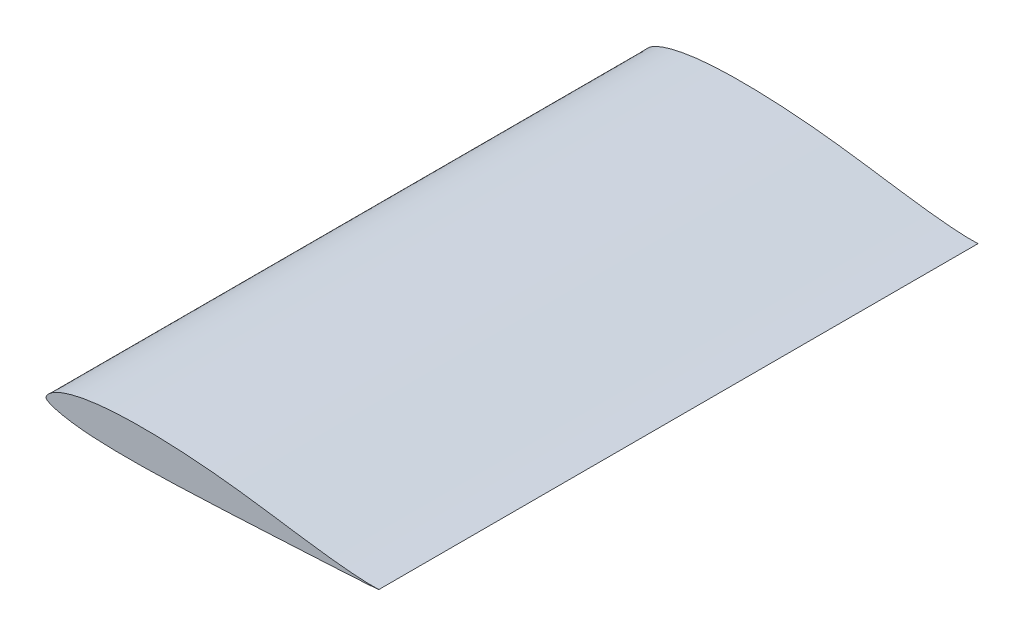
ISO-10303-21;
HEADER;
FILE_DESCRIPTION(('STEP AP214'),'2;1');
FILE_NAME('part.step','',(''),(''),'','','');
FILE_SCHEMA(('AUTOMOTIVE_DESIGN { 1 0 10303 214 1 1 1 1 }'));
ENDSEC;
DATA;
#1=APPLICATION_CONTEXT('core data for automotive mechanical design processes');
#2=APPLICATION_PROTOCOL_DEFINITION('international standard','automotive_design',2000,#1);
#3=PRODUCT_CONTEXT('',#1,'mechanical');
#4=PRODUCT('Part','Part','',(#3));
#5=PRODUCT_RELATED_PRODUCT_CATEGORY('part','',(#4));
#6=PRODUCT_DEFINITION_FORMATION('','',#4);
#7=PRODUCT_DEFINITION_CONTEXT('part definition',#1,'design');
#8=PRODUCT_DEFINITION('design','',#6,#7);
#9=PRODUCT_DEFINITION_SHAPE('','',#8);
#10=(LENGTH_UNIT() NAMED_UNIT(*) SI_UNIT(.MILLI.,.METRE.));
#11=(NAMED_UNIT(*) PLANE_ANGLE_UNIT() SI_UNIT($,.RADIAN.));
#12=(NAMED_UNIT(*) SI_UNIT($,.STERADIAN.) SOLID_ANGLE_UNIT());
#13=UNCERTAINTY_MEASURE_WITH_UNIT(LENGTH_MEASURE(1.E-05),#10,'distance_accuracy_value','');
#14=(GEOMETRIC_REPRESENTATION_CONTEXT(3) GLOBAL_UNCERTAINTY_ASSIGNED_CONTEXT((#13)) GLOBAL_UNIT_ASSIGNED_CONTEXT((#10,
#11,#12)) REPRESENTATION_CONTEXT('',''));
#15=CARTESIAN_POINT('',(0.,0.,0.));
#16=DIRECTION('',(0.,0.,1.));
#17=DIRECTION('',(1.,0.,0.));
#18=AXIS2_PLACEMENT_3D('',#15,#16,#17);
#19=CARTESIAN_POINT('',(100.,0.,180.));
#20=CARTESIAN_POINT('',(99.8731297421562,-0.0071263496234226,180.));
#21=CARTESIAN_POINT('',(99.5858986589307,-0.0220126325913472,180.));
#22=CARTESIAN_POINT('',(99.0723048944118,-0.0416908256166476,180.));
#23=CARTESIAN_POINT('',(98.3949638322904,-0.054005184052448,180.));
#24=CARTESIAN_POINT('',(97.5264118950756,-0.048417602615349,180.));
#25=CARTESIAN_POINT('',(96.4742931152867,-0.0203468103291035,180.));
#26=CARTESIAN_POINT('',(95.2465886939689,0.0314161833677873,180.));
#27=CARTESIAN_POINT('',(93.8505545777795,0.109574322760666,180.));
#28=CARTESIAN_POINT('',(92.293438030096,0.216481199586872,180.));
#29=CARTESIAN_POINT('',(90.5839619748836,0.355281050278794,180.));
#30=CARTESIAN_POINT('',(88.7334184387809,0.530991147040493,180.));
#31=CARTESIAN_POINT('',(86.7544527316392,0.743867583433741,180.));
#32=CARTESIAN_POINT('',(84.6592789398354,0.989937128321574,180.));
#33=CARTESIAN_POINT('',(82.459263130372,1.2664136743809,180.));
#34=CARTESIAN_POINT('',(80.1654376573725,1.57077847972011,180.));
#35=CARTESIAN_POINT('',(77.7889565729793,1.89945298186307,180.));
#36=CARTESIAN_POINT('',(75.3412148178229,2.24895922044247,180.));
#37=CARTESIAN_POINT('',(72.8328844359919,2.61390842251398,180.));
#38=CARTESIAN_POINT('',(70.2739152158194,2.9879952945212,180.));
#39=CARTESIAN_POINT('',(67.6745665606944,3.36710228924046,180.));
#40=CARTESIAN_POINT('',(65.0452696641362,3.74695580910662,180.));
#41=CARTESIAN_POINT('',(62.3930712753113,4.11701011707328,180.));
#42=CARTESIAN_POINT('',(59.7222322435053,4.46614480992606,180.));
#43=CARTESIAN_POINT('',(57.0391124993759,4.79810085083192,180.));
#44=CARTESIAN_POINT('',(54.351072114392,5.11213643643074,180.));
#45=CARTESIAN_POINT('',(51.6638315199252,5.39859094513008,180.));
#46=CARTESIAN_POINT('',(48.9815616144335,5.65263715778855,180.));
#47=CARTESIAN_POINT('',(46.3100785738808,5.87963794657507,180.));
#48=CARTESIAN_POINT('',(43.6565667998708,6.08014478723578,180.));
#49=CARTESIAN_POINT('',(41.028212232193,6.24947189211477,180.));
#50=CARTESIAN_POINT('',(38.4317076056366,6.38719861133135,180.));
#51=CARTESIAN_POINT('',(35.8744098434276,6.4956530697219,180.));
#52=CARTESIAN_POINT('',(33.3638716032272,6.57370683492832,180.));
#53=CARTESIAN_POINT('',(30.9070042879261,6.61795698852851,180.));
#54=CARTESIAN_POINT('',(28.5103565026845,6.62885009018535,180.));
#55=CARTESIAN_POINT('',(26.1810233749512,6.60840813007817,180.));
#56=CARTESIAN_POINT('',(23.9252329197264,6.55384718160539,180.));
#57=CARTESIAN_POINT('',(21.7477203312338,6.45971710785833,180.));
#58=CARTESIAN_POINT('',(19.6525516460904,6.33044077426623,180.));
#59=CARTESIAN_POINT('',(17.6447594134454,6.16963284704309,180.));
#60=CARTESIAN_POINT('',(15.7295966293119,5.97477202195844,180.));
#61=CARTESIAN_POINT('',(13.9109222435092,5.74331610646346,180.));
#62=CARTESIAN_POINT('',(12.1916017024725,5.48103748004068,180.));
#63=CARTESIAN_POINT('',(10.5754215524693,5.19159137924493,180.));
#64=CARTESIAN_POINT('',(9.06674853439058,4.87341840970931,180.));
#65=CARTESIAN_POINT('',(7.66854270262216,4.52701692788772,180.));
#66=CARTESIAN_POINT('',(6.38269909930736,4.15872088103797,180.));
#67=CARTESIAN_POINT('',(5.21166840884851,3.77135793205396,180.));
#68=CARTESIAN_POINT('',(4.15843908077848,3.36166084747128,180.));
#69=CARTESIAN_POINT('',(3.22292496827148,2.93310357259603,180.));
#70=CARTESIAN_POINT('',(2.40312425373494,2.49580371156189,180.));
#71=CARTESIAN_POINT('',(1.70014651075729,2.0549190730769,180.));
#72=CARTESIAN_POINT('',(1.11712391919751,1.6113443885371,180.));
#73=CARTESIAN_POINT('',(0.654431197921683,1.17440664764067,180.));
#74=CARTESIAN_POINT('',(0.305369199779341,0.755795207474001,180.));
#75=CARTESIAN_POINT('',(0.0876320705638158,0.371336729496624,180.));
#76=CARTESIAN_POINT('',(-0.0375359166936739,0.0106234864450049,180.));
#77=CARTESIAN_POINT('',(0.0834277973505954,-0.347444654246188,180.));
#78=CARTESIAN_POINT('',(0.421891675032964,-0.608211671687224,180.));
#79=CARTESIAN_POINT('',(0.874203128487307,-0.88822946935296,180.));
#80=CARTESIAN_POINT('',(1.4854499230709,-1.16534033419914,180.));
#81=CARTESIAN_POINT('',(2.23675136841454,-1.44188835342177,180.));
#82=CARTESIAN_POINT('',(3.13070633333904,-1.70878886604571,180.));
#83=CARTESIAN_POINT('',(4.16162986649332,-1.96682766117413,180.));
#84=CARTESIAN_POINT('',(5.32673683522163,-2.21279833046687,180.));
#85=CARTESIAN_POINT('',(6.62252423174852,-2.44292365151748,180.));
#86=CARTESIAN_POINT('',(8.04563021430656,-2.65465651996099,180.));
#87=CARTESIAN_POINT('',(9.59169102075808,-2.84803900103557,180.));
#88=CARTESIAN_POINT('',(11.2569522978932,-3.01996713020043,180.));
#89=CARTESIAN_POINT('',(13.038706849025,-3.16518052334094,180.));
#90=CARTESIAN_POINT('',(14.9338874169425,-3.2844037475508,180.));
#91=CARTESIAN_POINT('',(16.9379452884749,-3.38113026319625,180.));
#92=CARTESIAN_POINT('',(19.0459512735452,-3.45358896561638,180.));
#93=CARTESIAN_POINT('',(21.2535416262673,-3.49817384575008,180.));
#94=CARTESIAN_POINT('',(23.556044840974,-3.51884927836008,180.));
#95=CARTESIAN_POINT('',(25.9473188618634,-3.51947842136448,180.));
#96=CARTESIAN_POINT('',(28.4201356899826,-3.4997878983331,180.));
#97=CARTESIAN_POINT('',(30.9674344702377,-3.45954230976529,180.));
#98=CARTESIAN_POINT('',(33.5819134325002,-3.40194195053157,180.));
#99=CARTESIAN_POINT('',(36.2554854689595,-3.32943994368192,180.));
#100=CARTESIAN_POINT('',(38.9796993341622,-3.24195254091815,180.));
#101=CARTESIAN_POINT('',(41.7463859928491,-3.14046751319212,180.));
#102=CARTESIAN_POINT('',(44.5471274409492,-3.02795034394874,180.));
#103=CARTESIAN_POINT('',(47.3728093632821,-2.90675691317364,180.));
#104=CARTESIAN_POINT('',(50.2138352085322,-2.77800260829067,180.));
#105=CARTESIAN_POINT('',(53.0606447754066,-2.64344446057426,180.));
#106=CARTESIAN_POINT('',(55.9035928277926,-2.50459674549005,180.));
#107=CARTESIAN_POINT('',(58.7328615073874,-2.3631437087377,180.));
#108=CARTESIAN_POINT('',(61.5384851172286,-2.22050037318021,180.));
#109=CARTESIAN_POINT('',(65.2035936921467,-2.03181279265427,180.));
#110=CARTESIAN_POINT('',(67.9322719264146,-1.88880548265009,180.));
#111=CARTESIAN_POINT('',(69.735876,-1.793852,180.));
#112=B_SPLINE_CURVE_WITH_KNOTS('',3,(#19,#20,#21,#22,#23,#24,#25,#26,#27,#28,#29,#30,#31,#32,
#33,#34,#35,#36,#37,#38,#39,#40,#41,#42,#43,#44,#45,#46,#47,#48,#49,#50,#51,#52,#53,#54,#55,#56,
#57,#58,#59,#60,#61,#62,#63,#64,#65,#66,#67,#68,#69,#70,#71,#72,#73,#74,#75,#76,#77,#78,#79,#80,
#81,#82,#83,#84,#85,#86,#87,#88,#89,#90,#91,#92,#93,#94,#95,#96,#97,#98,#99,#100,#101,#102,#103,
#104,#105,#106,#107,#108,#109,#110,#111),.UNSPECIFIED.,.F.,.F.,(4,1,1,1,1,1,1,1,1,1,1,1,1,1,1,1,
1,1,1,1,1,1,1,1,1,1,1,1,1,1,1,1,1,1,1,1,1,1,1,1,1,1,1,1,1,1,1,1,1,1,1,1,1,1,1,1,1,1,1,1,1,1,1,1,
1,1,1,1,1,1,1,1,1,1,1,1,1,1,1,1,1,1,1,1,1,1,1,1,1,1,4),(0.,0.00220923852363808,
0.00500040715276348,0.00893547922845685,0.0139862944004528,0.0200999110607274,
0.0272331623928546,0.035349325377806,0.0444085815951702,0.0543681525349889,0.0651671223766626,
0.0767257423775045,0.0889721123671874,0.101843595876724,0.115275578830099,0.129201713347357,
0.143554069568907,0.158263416591045,0.173270548744768,0.188517036593157,0.203933656803972,
0.219457904412566,0.235074265065449,0.250763230849998,0.266461846300673,0.282125694194801,
0.297747091203574,0.313303395461786,0.328738699173902,0.344011606020782,0.359093531866023,
0.373943938781869,0.388511763473504,0.402761603282726,0.416664517324197,0.430178949571932,
0.443259533116455,0.455893010987885,0.46807008508328,0.479753340697727,0.490909964397989,
0.501535740841807,0.511624326593847,0.52114471215526,0.530077940880876,0.538426036081611,
0.546183426212128,0.553327174825242,0.559863049803919,0.565821039718911,0.571206957611546,
0.576005951092428,0.580233937768203,0.583918525257428,0.587059664699692,0.589647220098959,
0.591628453572832,0.593459553301607,0.595772041571616,0.598875730372835,0.602752548480143,
0.607392102872526,0.612796440306052,0.61896066587947,0.625865320980244,0.633494769221233,
0.641838350428337,0.650876949497999,0.660581819535131,0.670942079794454,0.68195496405002,
0.693595004344251,0.705823985623181,0.718625021858571,0.731982781166551,0.745856178462826,
0.760199101492908,0.774975912832791,0.790148519065502,0.805665087144037,0.821475377246348,
0.837535770780905,0.853798758259788,0.870208111852747,0.886708024088562,0.903243326604065,
0.919757809558127,0.936194252122913,0.952494258927816,0.968599217269703,1.),.UNSPECIFIED.);
#113=DIRECTION('',(0.,0.,-1.));
#114=VECTOR('',#113,1.);
#115=SURFACE_OF_LINEAR_EXTRUSION('',#112,#114);
#116=CARTESIAN_POINT('',(100.,0.,0.));
#117=CARTESIAN_POINT('',(99.8731297421562,-0.0071263496234226,0.));
#118=CARTESIAN_POINT('',(99.5858986589307,-0.0220126325913472,0.));
#119=CARTESIAN_POINT('',(99.0723048944118,-0.0416908256166476,0.));
#120=CARTESIAN_POINT('',(98.3949638322904,-0.054005184052448,0.));
#121=CARTESIAN_POINT('',(97.5264118950756,-0.048417602615349,0.));
#122=CARTESIAN_POINT('',(96.4742931152867,-0.0203468103291035,0.));
#123=CARTESIAN_POINT('',(95.2465886939689,0.0314161833677873,0.));
#124=CARTESIAN_POINT('',(93.8505545777795,0.109574322760666,0.));
#125=CARTESIAN_POINT('',(92.293438030096,0.216481199586872,0.));
#126=CARTESIAN_POINT('',(90.5839619748836,0.355281050278794,0.));
#127=CARTESIAN_POINT('',(88.7334184387809,0.530991147040493,0.));
#128=CARTESIAN_POINT('',(86.7544527316392,0.743867583433741,0.));
#129=CARTESIAN_POINT('',(84.6592789398354,0.989937128321574,0.));
#130=CARTESIAN_POINT('',(82.459263130372,1.2664136743809,0.));
#131=CARTESIAN_POINT('',(80.1654376573725,1.57077847972011,0.));
#132=CARTESIAN_POINT('',(77.7889565729793,1.89945298186307,0.));
#133=CARTESIAN_POINT('',(75.3412148178229,2.24895922044247,0.));
#134=CARTESIAN_POINT('',(72.8328844359919,2.61390842251398,0.));
#135=CARTESIAN_POINT('',(70.2739152158194,2.9879952945212,0.));
#136=CARTESIAN_POINT('',(67.6745665606944,3.36710228924046,0.));
#137=CARTESIAN_POINT('',(65.0452696641362,3.74695580910662,0.));
#138=CARTESIAN_POINT('',(62.3930712753113,4.11701011707328,0.));
#139=CARTESIAN_POINT('',(59.7222322435053,4.46614480992606,0.));
#140=CARTESIAN_POINT('',(57.0391124993759,4.79810085083192,0.));
#141=CARTESIAN_POINT('',(54.351072114392,5.11213643643074,0.));
#142=CARTESIAN_POINT('',(51.6638315199252,5.39859094513008,0.));
#143=CARTESIAN_POINT('',(48.9815616144335,5.65263715778855,0.));
#144=CARTESIAN_POINT('',(46.3100785738808,5.87963794657507,0.));
#145=CARTESIAN_POINT('',(43.6565667998708,6.08014478723578,0.));
#146=CARTESIAN_POINT('',(41.028212232193,6.24947189211477,0.));
#147=CARTESIAN_POINT('',(38.4317076056366,6.38719861133135,0.));
#148=CARTESIAN_POINT('',(35.8744098434276,6.4956530697219,0.));
#149=CARTESIAN_POINT('',(33.3638716032272,6.57370683492832,0.));
#150=CARTESIAN_POINT('',(30.9070042879261,6.61795698852851,0.));
#151=CARTESIAN_POINT('',(28.5103565026845,6.62885009018535,0.));
#152=CARTESIAN_POINT('',(26.1810233749512,6.60840813007817,0.));
#153=CARTESIAN_POINT('',(23.9252329197264,6.55384718160539,0.));
#154=CARTESIAN_POINT('',(21.7477203312338,6.45971710785833,0.));
#155=CARTESIAN_POINT('',(19.6525516460904,6.33044077426623,0.));
#156=CARTESIAN_POINT('',(17.6447594134454,6.16963284704309,0.));
#157=CARTESIAN_POINT('',(15.7295966293119,5.97477202195844,0.));
#158=CARTESIAN_POINT('',(13.9109222435092,5.74331610646346,0.));
#159=CARTESIAN_POINT('',(12.1916017024725,5.48103748004068,0.));
#160=CARTESIAN_POINT('',(10.5754215524693,5.19159137924493,0.));
#161=CARTESIAN_POINT('',(9.06674853439058,4.87341840970931,0.));
#162=CARTESIAN_POINT('',(7.66854270262216,4.52701692788772,0.));
#163=CARTESIAN_POINT('',(6.38269909930736,4.15872088103797,0.));
#164=CARTESIAN_POINT('',(5.21166840884851,3.77135793205396,0.));
#165=CARTESIAN_POINT('',(4.15843908077848,3.36166084747128,0.));
#166=CARTESIAN_POINT('',(3.22292496827148,2.93310357259603,0.));
#167=CARTESIAN_POINT('',(2.40312425373494,2.49580371156189,0.));
#168=CARTESIAN_POINT('',(1.70014651075729,2.0549190730769,0.));
#169=CARTESIAN_POINT('',(1.11712391919751,1.6113443885371,0.));
#170=CARTESIAN_POINT('',(0.654431197921683,1.17440664764067,0.));
#171=CARTESIAN_POINT('',(0.305369199779341,0.755795207474001,0.));
#172=CARTESIAN_POINT('',(0.0876320705638158,0.371336729496624,0.));
#173=CARTESIAN_POINT('',(-0.0375359166936739,0.0106234864450049,0.));
#174=CARTESIAN_POINT('',(0.0834277973505954,-0.347444654246188,0.));
#175=CARTESIAN_POINT('',(0.421891675032964,-0.608211671687224,0.));
#176=CARTESIAN_POINT('',(0.874203128487307,-0.88822946935296,0.));
#177=CARTESIAN_POINT('',(1.4854499230709,-1.16534033419914,0.));
#178=CARTESIAN_POINT('',(2.23675136841454,-1.44188835342177,0.));
#179=CARTESIAN_POINT('',(3.13070633333904,-1.70878886604571,0.));
#180=CARTESIAN_POINT('',(4.16162986649332,-1.96682766117413,0.));
#181=CARTESIAN_POINT('',(5.32673683522163,-2.21279833046687,0.));
#182=CARTESIAN_POINT('',(6.62252423174852,-2.44292365151748,0.));
#183=CARTESIAN_POINT('',(8.04563021430656,-2.65465651996099,0.));
#184=CARTESIAN_POINT('',(9.59169102075808,-2.84803900103557,0.));
#185=CARTESIAN_POINT('',(11.2569522978932,-3.01996713020043,0.));
#186=CARTESIAN_POINT('',(13.038706849025,-3.16518052334094,0.));
#187=CARTESIAN_POINT('',(14.9338874169425,-3.2844037475508,0.));
#188=CARTESIAN_POINT('',(16.9379452884749,-3.38113026319625,0.));
#189=CARTESIAN_POINT('',(19.0459512735452,-3.45358896561638,0.));
#190=CARTESIAN_POINT('',(21.2535416262673,-3.49817384575008,0.));
#191=CARTESIAN_POINT('',(23.556044840974,-3.51884927836008,0.));
#192=CARTESIAN_POINT('',(25.9473188618634,-3.51947842136448,0.));
#193=CARTESIAN_POINT('',(28.4201356899826,-3.4997878983331,0.));
#194=CARTESIAN_POINT('',(30.9674344702377,-3.45954230976529,0.));
#195=CARTESIAN_POINT('',(33.5819134325002,-3.40194195053157,0.));
#196=CARTESIAN_POINT('',(36.2554854689595,-3.32943994368192,0.));
#197=CARTESIAN_POINT('',(38.9796993341622,-3.24195254091815,0.));
#198=CARTESIAN_POINT('',(41.7463859928491,-3.14046751319212,0.));
#199=CARTESIAN_POINT('',(44.5471274409492,-3.02795034394874,0.));
#200=CARTESIAN_POINT('',(47.3728093632821,-2.90675691317364,0.));
#201=CARTESIAN_POINT('',(50.2138352085322,-2.77800260829067,0.));
#202=CARTESIAN_POINT('',(53.0606447754066,-2.64344446057426,0.));
#203=CARTESIAN_POINT('',(55.9035928277926,-2.50459674549005,0.));
#204=CARTESIAN_POINT('',(58.7328615073874,-2.3631437087377,0.));
#205=CARTESIAN_POINT('',(61.5384851172286,-2.22050037318021,0.));
#206=CARTESIAN_POINT('',(65.2035936921467,-2.03181279265427,0.));
#207=CARTESIAN_POINT('',(67.9322719264146,-1.88880548265009,0.));
#208=CARTESIAN_POINT('',(69.735876,-1.793852,0.));
#209=B_SPLINE_CURVE_WITH_KNOTS('',3,(#116,#117,#118,#119,#120,#121,#122,#123,#124,#125,#126,
#127,#128,#129,#130,#131,#132,#133,#134,#135,#136,#137,#138,#139,#140,#141,#142,#143,#144,#145,
#146,#147,#148,#149,#150,#151,#152,#153,#154,#155,#156,#157,#158,#159,#160,#161,#162,#163,#164,
#165,#166,#167,#168,#169,#170,#171,#172,#173,#174,#175,#176,#177,#178,#179,#180,#181,#182,#183,
#184,#185,#186,#187,#188,#189,#190,#191,#192,#193,#194,#195,#196,#197,#198,#199,#200,#201,#202,
#203,#204,#205,#206,#207,#208),.UNSPECIFIED.,.F.,.F.,(4,1,1,1,1,1,1,1,1,1,1,1,1,1,1,1,1,1,1,1,1,
1,1,1,1,1,1,1,1,1,1,1,1,1,1,1,1,1,1,1,1,1,1,1,1,1,1,1,1,1,1,1,1,1,1,1,1,1,1,1,1,1,1,1,1,1,1,1,1,
1,1,1,1,1,1,1,1,1,1,1,1,1,1,1,1,1,1,1,1,1,4),(0.,0.00220923852363808,0.00500040715276348,
0.00893547922845685,0.0139862944004528,0.0200999110607274,0.0272331623928546,0.035349325377806,
0.0444085815951702,0.0543681525349889,0.0651671223766626,0.0767257423775045,0.0889721123671874,
0.101843595876724,0.115275578830099,0.129201713347357,0.143554069568907,0.158263416591045,
0.173270548744768,0.188517036593157,0.203933656803972,0.219457904412566,0.235074265065449,
0.250763230849998,0.266461846300673,0.282125694194801,0.297747091203574,0.313303395461786,
0.328738699173902,0.344011606020782,0.359093531866023,0.373943938781869,0.388511763473504,
0.402761603282726,0.416664517324197,0.430178949571932,0.443259533116455,0.455893010987885,
0.46807008508328,0.479753340697727,0.490909964397989,0.501535740841807,0.511624326593847,
0.52114471215526,0.530077940880876,0.538426036081611,0.546183426212128,0.553327174825242,
0.559863049803919,0.565821039718911,0.571206957611546,0.576005951092428,0.580233937768203,
0.583918525257428,0.587059664699692,0.589647220098959,0.591628453572832,0.593459553301607,
0.595772041571616,0.598875730372835,0.602752548480143,0.607392102872526,0.612796440306052,
0.61896066587947,0.625865320980244,0.633494769221233,0.641838350428337,0.650876949497999,
0.660581819535131,0.670942079794454,0.68195496405002,0.693595004344251,0.705823985623181,
0.718625021858571,0.731982781166551,0.745856178462826,0.760199101492908,0.774975912832791,
0.790148519065502,0.805665087144037,0.821475377246348,0.837535770780905,0.853798758259788,
0.870208111852747,0.886708024088562,0.903243326604065,0.919757809558127,0.936194252122913,
0.952494258927816,0.968599217269703,1.),.UNSPECIFIED.);
#210=CARTESIAN_POINT('',(100.,0.,0.));
#211=VERTEX_POINT('',#210);
#212=CARTESIAN_POINT('',(69.735876,-1.793852,0.));
#213=VERTEX_POINT('',#212);
#214=EDGE_CURVE('E67',#211,#213,#209,.T.);
#215=ORIENTED_EDGE('',*,*,#214,.T.);
#216=DIRECTION('',(0.,0.,-1.));
#217=VECTOR('',#216,1.);
#218=CARTESIAN_POINT('',(69.735876,-1.793852,180.));
#219=LINE('',#218,#217);
#220=CARTESIAN_POINT('',(69.735876,-1.793852,180.));
#221=VERTEX_POINT('',#220);
#222=EDGE_CURVE('E11',#221,#213,#219,.T.);
#223=ORIENTED_EDGE('',*,*,#222,.F.);
#224=CARTESIAN_POINT('',(100.,0.,180.));
#225=VERTEX_POINT('',#224);
#226=EDGE_CURVE('E66',#225,#221,#112,.T.);
#227=ORIENTED_EDGE('',*,*,#226,.F.);
#228=DIRECTION('',(0.,0.,-1.));
#229=VECTOR('',#228,1.);
#230=CARTESIAN_POINT('',(100.,0.,180.));
#231=LINE('',#230,#229);
#232=EDGE_CURVE('E44',#225,#211,#231,.T.);
#233=ORIENTED_EDGE('',*,*,#232,.T.);
#234=EDGE_LOOP('',(#215,#223,#227,#233));
#235=FACE_BOUND('',#234,.T.);
#236=ADVANCED_FACE('F35',(#235),#115,.F.);
#237=CARTESIAN_POINT('',(55.908049,-2.503829,180.));
#238=CARTESIAN_POINT('',(57.7886789271328,-2.41085490784024,180.));
#239=CARTESIAN_POINT('',(60.5943483125345,-2.26910348836043,180.));
#240=CARTESIAN_POINT('',(64.3105329325762,-2.07779003728784,180.));
#241=CARTESIAN_POINT('',(67.0392539534988,-1.93560744381492,180.));
#242=CARTESIAN_POINT('',(69.715088177553,-1.79504929551181,180.));
#243=CARTESIAN_POINT('',(72.3285678654834,-1.65715716108293,180.));
#244=CARTESIAN_POINT('',(74.8703956195813,-1.52239905348513,180.));
#245=CARTESIAN_POINT('',(77.3316219415725,-1.39105709589477,180.));
#246=CARTESIAN_POINT('',(79.7036661638723,-1.26380599495562,180.));
#247=CARTESIAN_POINT('',(81.9782022174544,-1.14116517409252,180.));
#248=CARTESIAN_POINT('',(84.1472169805456,-1.02349492143523,180.));
#249=CARTESIAN_POINT('',(86.2030395673615,-0.911063377548542,180.));
#250=CARTESIAN_POINT('',(88.1382654934753,-0.804543604224132,180.));
#251=CARTESIAN_POINT('',(89.9457642708867,-0.704299249868897,180.));
#252=CARTESIAN_POINT('',(91.6188711771863,-0.609949109498808,180.));
#253=CARTESIAN_POINT('',(93.1515228494888,-0.521310939626904,180.));
#254=CARTESIAN_POINT('',(94.53817257151,-0.438608234271999,180.));
#255=CARTESIAN_POINT('',(95.7736895913212,-0.36162123590545,180.));
#256=CARTESIAN_POINT('',(96.8534986731263,-0.28980089649676,180.));
#257=CARTESIAN_POINT('',(97.7744131314089,-0.222674936774559,180.));
#258=CARTESIAN_POINT('',(98.5355265104215,-0.15727102904834,180.));
#259=CARTESIAN_POINT('',(99.1367794638072,-0.0940754761043931,180.));
#260=CARTESIAN_POINT('',(99.6070914481932,-0.0399022523142281,180.));
#261=CARTESIAN_POINT('',(99.8773074956878,-0.0110199593637515,180.));
#262=CARTESIAN_POINT('',(100.,0.,180.));
#263=B_SPLINE_CURVE_WITH_KNOTS('',3,(#237,#238,#239,#240,#241,#242,#243,#244,#245,#246,#247,
#248,#249,#250,#251,#252,#253,#254,#255,#256,#257,#258,#259,#260,#261,#262),.UNSPECIFIED.,.F.,
.F.,(4,1,1,1,1,1,1,1,1,1,1,1,1,1,1,1,1,1,1,1,1,1,1,4),(0.,0.127899985812533,0.190821407747378,
0.252760464928473,0.31350299793309,0.372831170633084,0.430531060751439,0.486402099982722,
0.540250729043364,0.591886627556224,0.64112705016448,0.687800246082705,0.731739459650661,
0.772778517384158,0.810765387812736,0.845567741620341,0.877059591943857,0.905122506427875,
0.92965429510162,0.950568660712637,0.967841974088424,0.981541610581215,0.991632593965443,1.),.UNSPECIFIED.);
#264=DIRECTION('',(0.,0.,-1.));
#265=VECTOR('',#264,1.);
#266=SURFACE_OF_LINEAR_EXTRUSION('',#263,#265);
#267=CARTESIAN_POINT('',(55.908049,-2.503829,0.));
#268=CARTESIAN_POINT('',(57.7886789271328,-2.41085490784024,0.));
#269=CARTESIAN_POINT('',(60.5943483125345,-2.26910348836043,0.));
#270=CARTESIAN_POINT('',(64.3105329325762,-2.07779003728784,0.));
#271=CARTESIAN_POINT('',(67.0392539534988,-1.93560744381492,0.));
#272=CARTESIAN_POINT('',(69.715088177553,-1.79504929551181,0.));
#273=CARTESIAN_POINT('',(72.3285678654834,-1.65715716108293,0.));
#274=CARTESIAN_POINT('',(74.8703956195813,-1.52239905348513,0.));
#275=CARTESIAN_POINT('',(77.3316219415725,-1.39105709589477,0.));
#276=CARTESIAN_POINT('',(79.7036661638723,-1.26380599495562,0.));
#277=CARTESIAN_POINT('',(81.9782022174544,-1.14116517409252,0.));
#278=CARTESIAN_POINT('',(84.1472169805456,-1.02349492143523,0.));
#279=CARTESIAN_POINT('',(86.2030395673615,-0.911063377548542,0.));
#280=CARTESIAN_POINT('',(88.1382654934753,-0.804543604224132,0.));
#281=CARTESIAN_POINT('',(89.9457642708867,-0.704299249868897,0.));
#282=CARTESIAN_POINT('',(91.6188711771863,-0.609949109498808,0.));
#283=CARTESIAN_POINT('',(93.1515228494888,-0.521310939626904,0.));
#284=CARTESIAN_POINT('',(94.53817257151,-0.438608234271999,0.));
#285=CARTESIAN_POINT('',(95.7736895913212,-0.36162123590545,0.));
#286=CARTESIAN_POINT('',(96.8534986731263,-0.28980089649676,0.));
#287=CARTESIAN_POINT('',(97.7744131314089,-0.222674936774559,0.));
#288=CARTESIAN_POINT('',(98.5355265104215,-0.15727102904834,0.));
#289=CARTESIAN_POINT('',(99.1367794638072,-0.0940754761043931,0.));
#290=CARTESIAN_POINT('',(99.6070914481932,-0.0399022523142281,0.));
#291=CARTESIAN_POINT('',(99.8773074956878,-0.0110199593637515,0.));
#292=CARTESIAN_POINT('',(100.,0.,0.));
#293=B_SPLINE_CURVE_WITH_KNOTS('',3,(#267,#268,#269,#270,#271,#272,#273,#274,#275,#276,#277,
#278,#279,#280,#281,#282,#283,#284,#285,#286,#287,#288,#289,#290,#291,#292),.UNSPECIFIED.,.F.,
.F.,(4,1,1,1,1,1,1,1,1,1,1,1,1,1,1,1,1,1,1,1,1,1,1,4),(0.,0.127899985812533,0.190821407747378,
0.252760464928473,0.31350299793309,0.372831170633084,0.430531060751439,0.486402099982722,
0.540250729043364,0.591886627556224,0.64112705016448,0.687800246082705,0.731739459650661,
0.772778517384158,0.810765387812736,0.845567741620341,0.877059591943857,0.905122506427875,
0.92965429510162,0.950568660712637,0.967841974088424,0.981541610581215,0.991632593965443,1.),.UNSPECIFIED.);
#294=EDGE_CURVE('E59',#213,#211,#293,.T.);
#295=ORIENTED_EDGE('',*,*,#294,.T.);
#296=ORIENTED_EDGE('',*,*,#232,.F.);
#297=EDGE_CURVE('E51',#221,#225,#263,.T.);
#298=ORIENTED_EDGE('',*,*,#297,.F.);
#299=ORIENTED_EDGE('',*,*,#222,.T.);
#300=EDGE_LOOP('',(#295,#296,#298,#299));
#301=FACE_BOUND('',#300,.T.);
#302=ADVANCED_FACE('F62',(#301),#266,.F.);
#303=CARTESIAN_POINT('',(0.,0.,180.));
#304=DIRECTION('',(0.,0.,1.));
#305=DIRECTION('',(1.,0.,0.));
#306=AXIS2_PLACEMENT_3D('',#303,#304,#305);
#307=PLANE('',#306);
#308=ORIENTED_EDGE('',*,*,#226,.T.);
#309=ORIENTED_EDGE('',*,*,#297,.T.);
#310=EDGE_LOOP('',(#308,#309));
#311=FACE_BOUND('',#310,.T.);
#312=ADVANCED_FACE('F94',(#311),#307,.T.);
#313=CARTESIAN_POINT('',(0.,0.,0.));
#314=DIRECTION('',(0.,0.,1.));
#315=DIRECTION('',(1.,0.,0.));
#316=AXIS2_PLACEMENT_3D('',#313,#314,#315);
#317=PLANE('',#316);
#318=ORIENTED_EDGE('',*,*,#214,.F.);
#319=ORIENTED_EDGE('',*,*,#294,.F.);
#320=EDGE_LOOP('',(#318,#319));
#321=FACE_BOUND('',#320,.T.);
#322=ADVANCED_FACE('F70',(#321),#317,.F.);
#323=CLOSED_SHELL('',(#236,#302,#312,#322));
#324=MANIFOLD_SOLID_BREP('B2',#323);
#325=ADVANCED_BREP_SHAPE_REPRESENTATION('',(#18,#324),#14);
#326=SHAPE_DEFINITION_REPRESENTATION(#9,#325);
ENDSEC;
END-ISO-10303-21;
